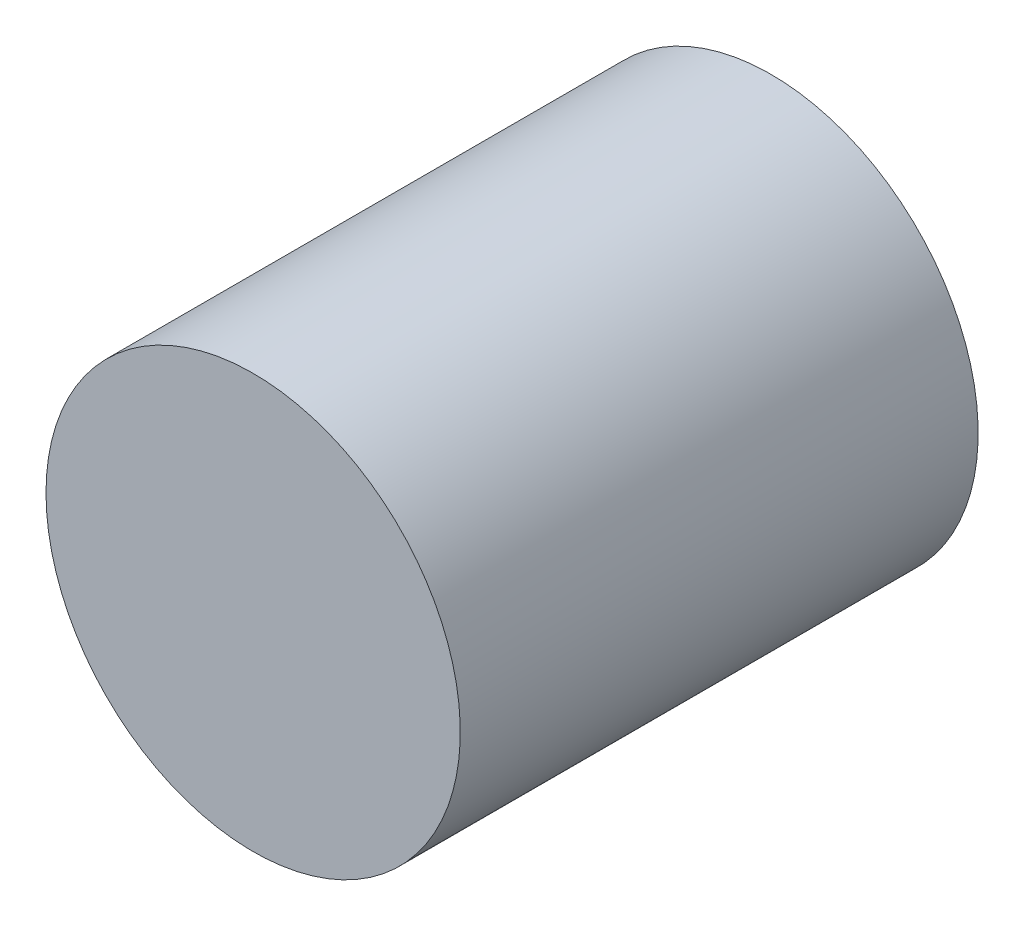
ISO-10303-21;
HEADER;
FILE_DESCRIPTION(('STEP AP214'),'2;1');
FILE_NAME('part.step','',(''),(''),'','','');
FILE_SCHEMA(('AUTOMOTIVE_DESIGN { 1 0 10303 214 1 1 1 1 }'));
ENDSEC;
DATA;
#1=APPLICATION_CONTEXT('core data for automotive mechanical design processes');
#2=APPLICATION_PROTOCOL_DEFINITION('international standard','automotive_design',2000,#1);
#3=PRODUCT_CONTEXT('',#1,'mechanical');
#4=PRODUCT('Part','Part','',(#3));
#5=PRODUCT_RELATED_PRODUCT_CATEGORY('part','',(#4));
#6=PRODUCT_DEFINITION_FORMATION('','',#4);
#7=PRODUCT_DEFINITION_CONTEXT('part definition',#1,'design');
#8=PRODUCT_DEFINITION('design','',#6,#7);
#9=PRODUCT_DEFINITION_SHAPE('','',#8);
#10=(LENGTH_UNIT() NAMED_UNIT(*) SI_UNIT(.MILLI.,.METRE.));
#11=(NAMED_UNIT(*) PLANE_ANGLE_UNIT() SI_UNIT($,.RADIAN.));
#12=(NAMED_UNIT(*) SI_UNIT($,.STERADIAN.) SOLID_ANGLE_UNIT());
#13=UNCERTAINTY_MEASURE_WITH_UNIT(LENGTH_MEASURE(1.E-05),#10,'distance_accuracy_value','');
#14=(GEOMETRIC_REPRESENTATION_CONTEXT(3) GLOBAL_UNCERTAINTY_ASSIGNED_CONTEXT((#13)) GLOBAL_UNIT_ASSIGNED_CONTEXT((#10,
#11,#12)) REPRESENTATION_CONTEXT('',''));
#15=CARTESIAN_POINT('',(0.,0.,0.));
#16=DIRECTION('',(0.,0.,1.));
#17=DIRECTION('',(1.,0.,0.));
#18=AXIS2_PLACEMENT_3D('',#15,#16,#17);
#19=CARTESIAN_POINT('',(0.8,0.,0.));
#20=DIRECTION('',(0.,0.,-1.));
#21=DIRECTION('',(-1.,0.,0.));
#22=AXIS2_PLACEMENT_3D('',#19,#20,#21);
#23=PLANE('',#22);
#24=CARTESIAN_POINT('',(0.,0.,0.));
#25=DIRECTION('',(0.,0.,-1.));
#26=DIRECTION('',(-1.,0.,0.));
#27=AXIS2_PLACEMENT_3D('',#24,#25,#26);
#28=CIRCLE('',#27,0.8);
#29=CARTESIAN_POINT('',(-0.8,0.,0.));
#30=VERTEX_POINT('',#29);
#31=EDGE_CURVE('E18',#30,#30,#28,.F.);
#32=ORIENTED_EDGE('',*,*,#31,.F.);
#33=EDGE_LOOP('',(#32));
#34=FACE_BOUND('',#33,.T.);
#35=ADVANCED_FACE('F15',(#34),#23,.T.);
#36=CARTESIAN_POINT('',(0.8,0.,2.));
#37=DIRECTION('',(0.,0.,-1.));
#38=DIRECTION('',(-1.,0.,0.));
#39=AXIS2_PLACEMENT_3D('',#36,#37,#38);
#40=PLANE('',#39);
#41=CARTESIAN_POINT('',(0.,0.,2.));
#42=DIRECTION('',(0.,0.,-1.));
#43=DIRECTION('',(-1.,0.,0.));
#44=AXIS2_PLACEMENT_3D('',#41,#42,#43);
#45=CIRCLE('',#44,0.8);
#46=CARTESIAN_POINT('',(-0.8,0.,2.));
#47=VERTEX_POINT('',#46);
#48=EDGE_CURVE('E10',#47,#47,#45,.T.);
#49=ORIENTED_EDGE('',*,*,#48,.F.);
#50=EDGE_LOOP('',(#49));
#51=FACE_BOUND('',#50,.T.);
#52=ADVANCED_FACE('F30',(#51),#40,.F.);
#53=CARTESIAN_POINT('',(0.,0.,0.));
#54=DIRECTION('',(0.,0.,-1.));
#55=DIRECTION('',(-1.,0.,0.));
#56=AXIS2_PLACEMENT_3D('',#53,#54,#55);
#57=CYLINDRICAL_SURFACE('',#56,0.8);
#58=ORIENTED_EDGE('',*,*,#31,.T.);
#59=EDGE_LOOP('',(#58));
#60=FACE_BOUND('',#59,.T.);
#61=ORIENTED_EDGE('',*,*,#48,.T.);
#62=EDGE_LOOP('',(#61));
#63=FACE_BOUND('',#62,.T.);
#64=ADVANCED_FACE('F27',(#60,#63),#57,.T.);
#65=CLOSED_SHELL('',(#35,#52,#64));
#66=MANIFOLD_SOLID_BREP('B1',#65);
#67=ADVANCED_BREP_SHAPE_REPRESENTATION('',(#18,#66),#14);
#68=SHAPE_DEFINITION_REPRESENTATION(#9,#67);
ENDSEC;
END-ISO-10303-21;
